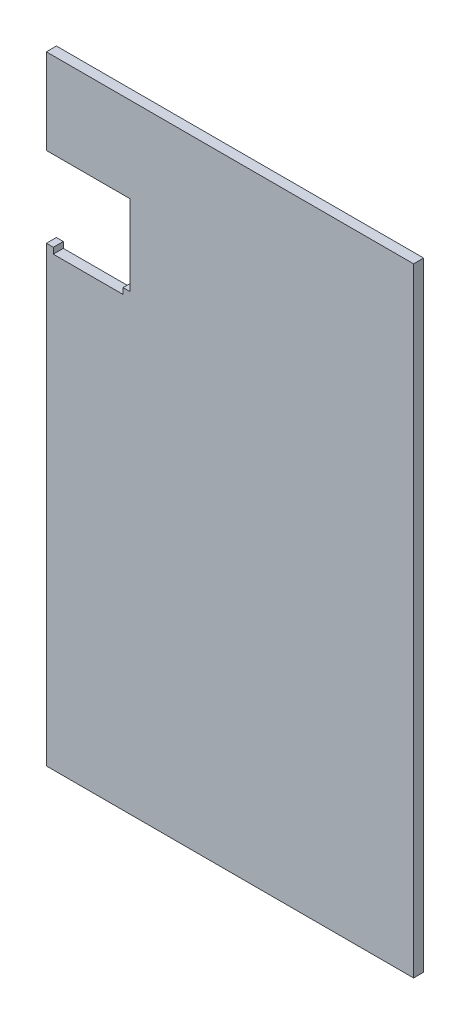
ISO-10303-21;
HEADER;
FILE_DESCRIPTION(('STEP AP214'),'2;1');
FILE_NAME('part.step','',(''),(''),'','','');
FILE_SCHEMA(('AUTOMOTIVE_DESIGN { 1 0 10303 214 1 1 1 1 }'));
ENDSEC;
DATA;
#1=APPLICATION_CONTEXT('core data for automotive mechanical design processes');
#2=APPLICATION_PROTOCOL_DEFINITION('international standard','automotive_design',2000,#1);
#3=PRODUCT_CONTEXT('',#1,'mechanical');
#4=PRODUCT('Part','Part','',(#3));
#5=PRODUCT_RELATED_PRODUCT_CATEGORY('part','',(#4));
#6=PRODUCT_DEFINITION_FORMATION('','',#4);
#7=PRODUCT_DEFINITION_CONTEXT('part definition',#1,'design');
#8=PRODUCT_DEFINITION('design','',#6,#7);
#9=PRODUCT_DEFINITION_SHAPE('','',#8);
#10=(LENGTH_UNIT() NAMED_UNIT(*) SI_UNIT(.MILLI.,.METRE.));
#11=(NAMED_UNIT(*) PLANE_ANGLE_UNIT() SI_UNIT($,.RADIAN.));
#12=(NAMED_UNIT(*) SI_UNIT($,.STERADIAN.) SOLID_ANGLE_UNIT());
#13=UNCERTAINTY_MEASURE_WITH_UNIT(LENGTH_MEASURE(1.E-05),#10,'distance_accuracy_value','');
#14=(GEOMETRIC_REPRESENTATION_CONTEXT(3) GLOBAL_UNCERTAINTY_ASSIGNED_CONTEXT((#13)) GLOBAL_UNIT_ASSIGNED_CONTEXT((#10,
#11,#12)) REPRESENTATION_CONTEXT('',''));
#15=CARTESIAN_POINT('',(0.,0.,0.));
#16=DIRECTION('',(0.,0.,1.));
#17=DIRECTION('',(1.,0.,0.));
#18=AXIS2_PLACEMENT_3D('',#15,#16,#17);
#19=CARTESIAN_POINT('',(-7.23599338667782,-26.8104545589035,-7.));
#20=DIRECTION('',(0.,-1.,0.));
#21=DIRECTION('',(0.,0.,-1.));
#22=AXIS2_PLACEMENT_3D('',#19,#20,#21);
#23=PLANE('',#22);
#24=DIRECTION('',(1.,0.,0.));
#25=VECTOR('',#24,1.);
#26=CARTESIAN_POINT('',(0.,-26.8104545589035,0.));
#27=LINE('',#26,#25);
#28=CARTESIAN_POINT('',(-9.34313558616395,-26.8104545589035,0.));
#29=VERTEX_POINT('',#28);
#30=CARTESIAN_POINT('',(-7.23599338667782,-26.8104545589035,0.));
#31=VERTEX_POINT('',#30);
#32=EDGE_CURVE('E205',#29,#31,#27,.T.);
#33=ORIENTED_EDGE('',*,*,#32,.F.);
#34=DIRECTION('',(0.,0.,1.));
#35=VECTOR('',#34,1.);
#36=CARTESIAN_POINT('',(-9.34313558616395,-26.8104545589035,-7.));
#37=LINE('',#36,#35);
#38=CARTESIAN_POINT('',(-9.34313558616395,-26.8104545589035,3.));
#39=VERTEX_POINT('',#38);
#40=EDGE_CURVE('E11',#29,#39,#37,.T.);
#41=ORIENTED_EDGE('',*,*,#40,.T.);
#42=DIRECTION('',(1.,0.,0.));
#43=VECTOR('',#42,1.);
#44=CARTESIAN_POINT('',(-7.23599338667782,-26.8104545589035,3.));
#45=LINE('',#44,#43);
#46=CARTESIAN_POINT('',(-7.23599338667782,-26.8104545589035,3.));
#47=VERTEX_POINT('',#46);
#48=EDGE_CURVE('E156',#39,#47,#45,.T.);
#49=ORIENTED_EDGE('',*,*,#48,.T.);
#50=DIRECTION('',(0.,0.,1.));
#51=VECTOR('',#50,1.);
#52=CARTESIAN_POINT('',(-7.23599338667782,-26.8104545589035,-7.));
#53=LINE('',#52,#51);
#54=EDGE_CURVE('E161',#31,#47,#53,.T.);
#55=ORIENTED_EDGE('',*,*,#54,.F.);
#56=EDGE_LOOP('',(#33,#41,#49,#55));
#57=FACE_BOUND('',#56,.T.);
#58=ADVANCED_FACE('F33',(#57),#23,.F.);
#59=CARTESIAN_POINT('',(-32.2359933866778,22.6895454410965,3.));
#60=DIRECTION('',(1.,0.,0.));
#61=DIRECTION('',(0.,0.,-1.));
#62=AXIS2_PLACEMENT_3D('',#59,#60,#61);
#63=PLANE('',#62);
#64=DIRECTION('',(0.,-1.,0.));
#65=VECTOR('',#64,1.);
#66=CARTESIAN_POINT('',(-32.2359933866778,22.6895454410965,3.));
#67=LINE('',#66,#65);
#68=CARTESIAN_POINT('',(-32.2359933866778,-26.8104545589035,3.));
#69=VERTEX_POINT('',#68);
#70=CARTESIAN_POINT('',(-32.2359933866778,-161.92931403441,3.));
#71=VERTEX_POINT('',#70);
#72=EDGE_CURVE('E173',#69,#71,#67,.T.);
#73=ORIENTED_EDGE('',*,*,#72,.F.);
#74=DIRECTION('',(0.,0.,1.));
#75=VECTOR('',#74,1.);
#76=CARTESIAN_POINT('',(-32.2359933866778,-26.8104545589035,-7.));
#77=LINE('',#76,#75);
#78=CARTESIAN_POINT('',(-32.2359933866778,-26.8104545589035,0.));
#79=VERTEX_POINT('',#78);
#80=EDGE_CURVE('E165',#79,#69,#77,.T.);
#81=ORIENTED_EDGE('',*,*,#80,.F.);
#82=DIRECTION('',(0.,-1.,0.));
#83=VECTOR('',#82,1.);
#84=CARTESIAN_POINT('',(-32.2359933866778,22.6895454410965,0.));
#85=LINE('',#84,#83);
#86=CARTESIAN_POINT('',(-32.2359933866778,-161.92931403441,0.));
#87=VERTEX_POINT('',#86);
#88=EDGE_CURVE('E164',#79,#87,#85,.T.);
#89=ORIENTED_EDGE('',*,*,#88,.T.);
#90=DIRECTION('',(0.,0.,-1.));
#91=VECTOR('',#90,1.);
#92=CARTESIAN_POINT('',(-32.2359933866778,-161.92931403441,3.));
#93=LINE('',#92,#91);
#94=EDGE_CURVE('E197',#71,#87,#93,.T.);
#95=ORIENTED_EDGE('',*,*,#94,.F.);
#96=EDGE_LOOP('',(#73,#81,#89,#95));
#97=FACE_BOUND('',#96,.T.);
#98=ADVANCED_FACE('F218',(#97),#63,.F.);
#99=CARTESIAN_POINT('',(-32.2359933866778,22.6895454410965,0.));
#100=VERTEX_POINT('',#99);
#101=CARTESIAN_POINT('',(-32.2359933866778,-2.81045455890352,0.));
#102=VERTEX_POINT('',#101);
#103=EDGE_CURVE('E180',#100,#102,#85,.T.);
#104=ORIENTED_EDGE('',*,*,#103,.T.);
#105=DIRECTION('',(0.,0.,1.));
#106=VECTOR('',#105,1.);
#107=CARTESIAN_POINT('',(-32.2359933866778,-2.81045455890353,-7.));
#108=LINE('',#107,#106);
#109=CARTESIAN_POINT('',(-32.2359933866778,-2.81045455890353,3.));
#110=VERTEX_POINT('',#109);
#111=EDGE_CURVE('E56',#102,#110,#108,.T.);
#112=ORIENTED_EDGE('',*,*,#111,.T.);
#113=CARTESIAN_POINT('',(-32.2359933866778,22.6895454410965,3.));
#114=VERTEX_POINT('',#113);
#115=EDGE_CURVE('E169',#114,#110,#67,.T.);
#116=ORIENTED_EDGE('',*,*,#115,.F.);
#117=DIRECTION('',(0.,0.,-1.));
#118=VECTOR('',#117,1.);
#119=CARTESIAN_POINT('',(-32.2359933866778,22.6895454410965,3.));
#120=LINE('',#119,#118);
#121=EDGE_CURVE('E179',#114,#100,#120,.T.);
#122=ORIENTED_EDGE('',*,*,#121,.T.);
#123=EDGE_LOOP('',(#104,#112,#116,#122));
#124=FACE_BOUND('',#123,.T.);
#125=ADVANCED_FACE('F35',(#124),#63,.F.);
#126=CARTESIAN_POINT('',(-32.2359933866778,-161.92931403441,3.));
#127=DIRECTION('',(0.,1.,0.));
#128=DIRECTION('',(0.,0.,1.));
#129=AXIS2_PLACEMENT_3D('',#126,#127,#128);
#130=PLANE('',#129);
#131=DIRECTION('',(1.,0.,0.));
#132=VECTOR('',#131,1.);
#133=CARTESIAN_POINT('',(-32.2359933866778,-161.92931403441,0.));
#134=LINE('',#133,#132);
#135=CARTESIAN_POINT('',(77.3897208878509,-161.92931403441,0.));
#136=VERTEX_POINT('',#135);
#137=EDGE_CURVE('E183',#87,#136,#134,.T.);
#138=ORIENTED_EDGE('',*,*,#137,.T.);
#139=DIRECTION('',(0.,0.,-1.));
#140=VECTOR('',#139,1.);
#141=CARTESIAN_POINT('',(77.3897208878509,-161.92931403441,3.));
#142=LINE('',#141,#140);
#143=CARTESIAN_POINT('',(77.3897208878509,-161.92931403441,3.));
#144=VERTEX_POINT('',#143);
#145=EDGE_CURVE('E194',#144,#136,#142,.T.);
#146=ORIENTED_EDGE('',*,*,#145,.F.);
#147=DIRECTION('',(1.,0.,0.));
#148=VECTOR('',#147,1.);
#149=CARTESIAN_POINT('',(-32.2359933866778,-161.92931403441,3.));
#150=LINE('',#149,#148);
#151=EDGE_CURVE('E172',#71,#144,#150,.T.);
#152=ORIENTED_EDGE('',*,*,#151,.F.);
#153=ORIENTED_EDGE('',*,*,#94,.T.);
#154=EDGE_LOOP('',(#138,#146,#152,#153));
#155=FACE_BOUND('',#154,.T.);
#156=ADVANCED_FACE('F260',(#155),#130,.F.);
#157=CARTESIAN_POINT('',(77.3897208878509,22.6895454410965,3.));
#158=DIRECTION('',(-1.,0.,0.));
#159=DIRECTION('',(0.,-1.,0.));
#160=AXIS2_PLACEMENT_3D('',#157,#158,#159);
#161=PLANE('',#160);
#162=DIRECTION('',(0.,1.,0.));
#163=VECTOR('',#162,1.);
#164=CARTESIAN_POINT('',(77.3897208878509,22.6895454410965,0.));
#165=LINE('',#164,#163);
#166=CARTESIAN_POINT('',(77.3897208878509,22.6895454410965,0.));
#167=VERTEX_POINT('',#166);
#168=EDGE_CURVE('E185',#136,#167,#165,.T.);
#169=ORIENTED_EDGE('',*,*,#168,.T.);
#170=DIRECTION('',(0.,0.,-1.));
#171=VECTOR('',#170,1.);
#172=CARTESIAN_POINT('',(77.3897208878509,22.6895454410965,3.));
#173=LINE('',#172,#171);
#174=CARTESIAN_POINT('',(77.3897208878509,22.6895454410965,3.));
#175=VERTEX_POINT('',#174);
#176=EDGE_CURVE('E191',#175,#167,#173,.T.);
#177=ORIENTED_EDGE('',*,*,#176,.F.);
#178=DIRECTION('',(0.,1.,0.));
#179=VECTOR('',#178,1.);
#180=CARTESIAN_POINT('',(77.3897208878509,22.6895454410965,3.));
#181=LINE('',#180,#179);
#182=EDGE_CURVE('E175',#144,#175,#181,.T.);
#183=ORIENTED_EDGE('',*,*,#182,.F.);
#184=ORIENTED_EDGE('',*,*,#145,.T.);
#185=EDGE_LOOP('',(#169,#177,#183,#184));
#186=FACE_BOUND('',#185,.T.);
#187=ADVANCED_FACE('F257',(#186),#161,.F.);
#188=CARTESIAN_POINT('',(-32.2359933866778,22.6895454410965,3.));
#189=DIRECTION('',(0.,-1.,0.));
#190=DIRECTION('',(0.,0.,-1.));
#191=AXIS2_PLACEMENT_3D('',#188,#189,#190);
#192=PLANE('',#191);
#193=DIRECTION('',(-1.,0.,0.));
#194=VECTOR('',#193,1.);
#195=CARTESIAN_POINT('',(-32.2359933866778,22.6895454410965,0.));
#196=LINE('',#195,#194);
#197=EDGE_CURVE('E187',#167,#100,#196,.T.);
#198=ORIENTED_EDGE('',*,*,#197,.T.);
#199=ORIENTED_EDGE('',*,*,#121,.F.);
#200=DIRECTION('',(-1.,0.,0.));
#201=VECTOR('',#200,1.);
#202=CARTESIAN_POINT('',(-32.2359933866778,22.6895454410965,3.));
#203=LINE('',#202,#201);
#204=EDGE_CURVE('E177',#175,#114,#203,.T.);
#205=ORIENTED_EDGE('',*,*,#204,.F.);
#206=ORIENTED_EDGE('',*,*,#176,.T.);
#207=EDGE_LOOP('',(#198,#199,#205,#206));
#208=FACE_BOUND('',#207,.T.);
#209=ADVANCED_FACE('F253',(#208),#192,.F.);
#210=CARTESIAN_POINT('',(0.,0.,3.));
#211=DIRECTION('',(0.,0.,1.));
#212=DIRECTION('',(1.,0.,0.));
#213=AXIS2_PLACEMENT_3D('',#210,#211,#212);
#214=PLANE('',#213);
#215=DIRECTION('',(0.,1.,0.));
#216=VECTOR('',#215,1.);
#217=CARTESIAN_POINT('',(-9.34313558616395,0.,3.));
#218=LINE('',#217,#216);
#219=CARTESIAN_POINT('',(-9.34313558616395,-28.5871879703418,3.));
#220=VERTEX_POINT('',#219);
#221=EDGE_CURVE('E148',#220,#39,#218,.T.);
#222=ORIENTED_EDGE('',*,*,#221,.F.);
#223=DIRECTION('',(1.,0.,0.));
#224=VECTOR('',#223,1.);
#225=CARTESIAN_POINT('',(0.,-28.5871879703418,3.));
#226=LINE('',#225,#224);
#227=CARTESIAN_POINT('',(-30.1686300780446,-28.5871879703418,3.));
#228=VERTEX_POINT('',#227);
#229=EDGE_CURVE('E129',#228,#220,#226,.T.);
#230=ORIENTED_EDGE('',*,*,#229,.F.);
#231=DIRECTION('',(0.,-1.,0.));
#232=VECTOR('',#231,1.);
#233=CARTESIAN_POINT('',(-30.1686300780446,0.,3.));
#234=LINE('',#233,#232);
#235=CARTESIAN_POINT('',(-30.1686300780446,-26.8104545589035,3.));
#236=VERTEX_POINT('',#235);
#237=EDGE_CURVE('E145',#236,#228,#234,.T.);
#238=ORIENTED_EDGE('',*,*,#237,.F.);
#239=EDGE_CURVE('E157',#69,#236,#45,.T.);
#240=ORIENTED_EDGE('',*,*,#239,.F.);
#241=ORIENTED_EDGE('',*,*,#72,.T.);
#242=ORIENTED_EDGE('',*,*,#151,.T.);
#243=ORIENTED_EDGE('',*,*,#182,.T.);
#244=ORIENTED_EDGE('',*,*,#204,.T.);
#245=ORIENTED_EDGE('',*,*,#115,.T.);
#246=DIRECTION('',(-1.,0.,0.));
#247=VECTOR('',#246,1.);
#248=CARTESIAN_POINT('',(-7.23599338667782,-2.81045455890353,3.));
#249=LINE('',#248,#247);
#250=CARTESIAN_POINT('',(-7.23599338667782,-2.81045455890353,3.));
#251=VERTEX_POINT('',#250);
#252=EDGE_CURVE('E154',#251,#110,#249,.T.);
#253=ORIENTED_EDGE('',*,*,#252,.F.);
#254=DIRECTION('',(0.,1.,0.));
#255=VECTOR('',#254,1.);
#256=CARTESIAN_POINT('',(-7.23599338667782,-2.81045455890353,3.));
#257=LINE('',#256,#255);
#258=EDGE_CURVE('E151',#47,#251,#257,.T.);
#259=ORIENTED_EDGE('',*,*,#258,.F.);
#260=ORIENTED_EDGE('',*,*,#48,.F.);
#261=EDGE_LOOP('',(#222,#230,#238,#240,#241,#242,#243,#244,#245,#253,#259,#260));
#262=FACE_BOUND('',#261,.T.);
#263=ADVANCED_FACE('F220',(#262),#214,.T.);
#264=CARTESIAN_POINT('',(0.,0.,0.));
#265=DIRECTION('',(0.,0.,1.));
#266=DIRECTION('',(1.,0.,0.));
#267=AXIS2_PLACEMENT_3D('',#264,#265,#266);
#268=PLANE('',#267);
#269=DIRECTION('',(-1.,0.,0.));
#270=VECTOR('',#269,1.);
#271=CARTESIAN_POINT('',(-9.34313558616395,-28.5871879703418,0.));
#272=LINE('',#271,#270);
#273=CARTESIAN_POINT('',(-9.34313558616395,-28.5871879703418,0.));
#274=VERTEX_POINT('',#273);
#275=CARTESIAN_POINT('',(-30.1686300780446,-28.5871879703418,0.));
#276=VERTEX_POINT('',#275);
#277=EDGE_CURVE('E127',#274,#276,#272,.T.);
#278=ORIENTED_EDGE('',*,*,#277,.F.);
#279=DIRECTION('',(0.,-1.,0.));
#280=VECTOR('',#279,1.);
#281=CARTESIAN_POINT('',(-9.34313558616395,-26.8104545589035,0.));
#282=LINE('',#281,#280);
#283=EDGE_CURVE('E135',#29,#274,#282,.T.);
#284=ORIENTED_EDGE('',*,*,#283,.F.);
#285=ORIENTED_EDGE('',*,*,#32,.T.);
#286=DIRECTION('',(0.,1.,0.));
#287=VECTOR('',#286,1.);
#288=CARTESIAN_POINT('',(-7.23599338667782,0.,0.));
#289=LINE('',#288,#287);
#290=CARTESIAN_POINT('',(-7.23599338667782,-2.81045455890353,0.));
#291=VERTEX_POINT('',#290);
#292=EDGE_CURVE('E202',#31,#291,#289,.T.);
#293=ORIENTED_EDGE('',*,*,#292,.T.);
#294=DIRECTION('',(-1.,0.,0.));
#295=VECTOR('',#294,1.);
#296=CARTESIAN_POINT('',(0.,-2.81045455890353,0.));
#297=LINE('',#296,#295);
#298=EDGE_CURVE('E200',#291,#102,#297,.T.);
#299=ORIENTED_EDGE('',*,*,#298,.T.);
#300=ORIENTED_EDGE('',*,*,#103,.F.);
#301=ORIENTED_EDGE('',*,*,#197,.F.);
#302=ORIENTED_EDGE('',*,*,#168,.F.);
#303=ORIENTED_EDGE('',*,*,#137,.F.);
#304=ORIENTED_EDGE('',*,*,#88,.F.);
#305=CARTESIAN_POINT('',(-30.1686300780446,-26.8104545589035,0.));
#306=VERTEX_POINT('',#305);
#307=EDGE_CURVE('E206',#79,#306,#27,.T.);
#308=ORIENTED_EDGE('',*,*,#307,.T.);
#309=DIRECTION('',(0.,1.,0.));
#310=VECTOR('',#309,1.);
#311=CARTESIAN_POINT('',(-30.1686300780446,-26.8104545589035,0.));
#312=LINE('',#311,#310);
#313=EDGE_CURVE('E48',#276,#306,#312,.T.);
#314=ORIENTED_EDGE('',*,*,#313,.F.);
#315=EDGE_LOOP('',(#278,#284,#285,#293,#299,#300,#301,#302,#303,#304,#308,#314));
#316=FACE_BOUND('',#315,.T.);
#317=ADVANCED_FACE('F140',(#316),#268,.F.);
#318=CARTESIAN_POINT('',(-7.23599338667782,-2.81045455890353,-7.));
#319=DIRECTION('',(1.,0.,0.));
#320=DIRECTION('',(0.,0.,-1.));
#321=AXIS2_PLACEMENT_3D('',#318,#319,#320);
#322=PLANE('',#321);
#323=ORIENTED_EDGE('',*,*,#54,.T.);
#324=ORIENTED_EDGE('',*,*,#258,.T.);
#325=DIRECTION('',(0.,0.,1.));
#326=VECTOR('',#325,1.);
#327=CARTESIAN_POINT('',(-7.23599338667782,-2.81045455890353,-7.));
#328=LINE('',#327,#326);
#329=EDGE_CURVE('E160',#291,#251,#328,.T.);
#330=ORIENTED_EDGE('',*,*,#329,.F.);
#331=ORIENTED_EDGE('',*,*,#292,.F.);
#332=EDGE_LOOP('',(#323,#324,#330,#331));
#333=FACE_BOUND('',#332,.T.);
#334=ADVANCED_FACE('F240',(#333),#322,.F.);
#335=ORIENTED_EDGE('',*,*,#239,.T.);
#336=DIRECTION('',(0.,0.,-1.));
#337=VECTOR('',#336,1.);
#338=CARTESIAN_POINT('',(-30.1686300780446,-26.8104545589035,-7.));
#339=LINE('',#338,#337);
#340=EDGE_CURVE('E41',#236,#306,#339,.T.);
#341=ORIENTED_EDGE('',*,*,#340,.T.);
#342=ORIENTED_EDGE('',*,*,#307,.F.);
#343=ORIENTED_EDGE('',*,*,#80,.T.);
#344=EDGE_LOOP('',(#335,#341,#342,#343));
#345=FACE_BOUND('',#344,.T.);
#346=ADVANCED_FACE('F208',(#345),#23,.F.);
#347=CARTESIAN_POINT('',(-7.23599338667782,-2.81045455890353,-7.));
#348=DIRECTION('',(0.,1.,0.));
#349=DIRECTION('',(0.,0.,1.));
#350=AXIS2_PLACEMENT_3D('',#347,#348,#349);
#351=PLANE('',#350);
#352=ORIENTED_EDGE('',*,*,#329,.T.);
#353=ORIENTED_EDGE('',*,*,#252,.T.);
#354=ORIENTED_EDGE('',*,*,#111,.F.);
#355=ORIENTED_EDGE('',*,*,#298,.F.);
#356=EDGE_LOOP('',(#352,#353,#354,#355));
#357=FACE_BOUND('',#356,.T.);
#358=ADVANCED_FACE('F230',(#357),#351,.F.);
#359=CARTESIAN_POINT('',(-9.34313558616395,-26.8104545589035,10.));
#360=DIRECTION('',(1.,0.,0.));
#361=DIRECTION('',(0.,0.,-1.));
#362=AXIS2_PLACEMENT_3D('',#359,#360,#361);
#363=PLANE('',#362);
#364=ORIENTED_EDGE('',*,*,#221,.T.);
#365=ORIENTED_EDGE('',*,*,#40,.F.);
#366=ORIENTED_EDGE('',*,*,#283,.T.);
#367=DIRECTION('',(0.,0.,-1.));
#368=VECTOR('',#367,1.);
#369=CARTESIAN_POINT('',(-9.34313558616395,-28.5871879703418,10.));
#370=LINE('',#369,#368);
#371=EDGE_CURVE('E122',#220,#274,#370,.T.);
#372=ORIENTED_EDGE('',*,*,#371,.F.);
#373=EDGE_LOOP('',(#364,#365,#366,#372));
#374=FACE_BOUND('',#373,.T.);
#375=ADVANCED_FACE('F136',(#374),#363,.F.);
#376=CARTESIAN_POINT('',(-30.1686300780446,-26.8104545589035,10.));
#377=DIRECTION('',(-1.,0.,0.));
#378=DIRECTION('',(0.,0.,1.));
#379=AXIS2_PLACEMENT_3D('',#376,#377,#378);
#380=PLANE('',#379);
#381=ORIENTED_EDGE('',*,*,#237,.T.);
#382=DIRECTION('',(0.,0.,-1.));
#383=VECTOR('',#382,1.);
#384=CARTESIAN_POINT('',(-30.1686300780446,-28.5871879703418,10.));
#385=LINE('',#384,#383);
#386=EDGE_CURVE('E132',#228,#276,#385,.T.);
#387=ORIENTED_EDGE('',*,*,#386,.T.);
#388=ORIENTED_EDGE('',*,*,#313,.T.);
#389=ORIENTED_EDGE('',*,*,#340,.F.);
#390=EDGE_LOOP('',(#381,#387,#388,#389));
#391=FACE_BOUND('',#390,.T.);
#392=ADVANCED_FACE('F222',(#391),#380,.F.);
#393=CARTESIAN_POINT('',(-9.34313558616395,-28.5871879703418,10.));
#394=DIRECTION('',(0.,-1.,0.));
#395=DIRECTION('',(0.,0.,-1.));
#396=AXIS2_PLACEMENT_3D('',#393,#394,#395);
#397=PLANE('',#396);
#398=ORIENTED_EDGE('',*,*,#229,.T.);
#399=ORIENTED_EDGE('',*,*,#371,.T.);
#400=ORIENTED_EDGE('',*,*,#277,.T.);
#401=ORIENTED_EDGE('',*,*,#386,.F.);
#402=EDGE_LOOP('',(#398,#399,#400,#401));
#403=FACE_BOUND('',#402,.T.);
#404=ADVANCED_FACE('F124',(#403),#397,.F.);
#405=CLOSED_SHELL('',(#58,#98,#125,#156,#187,#209,#263,#317,#334,#346,#358,#375,#392,#404));
#406=MANIFOLD_SOLID_BREP('B2',#405);
#407=ADVANCED_BREP_SHAPE_REPRESENTATION('',(#18,#406),#14);
#408=SHAPE_DEFINITION_REPRESENTATION(#9,#407);
ENDSEC;
END-ISO-10303-21;
